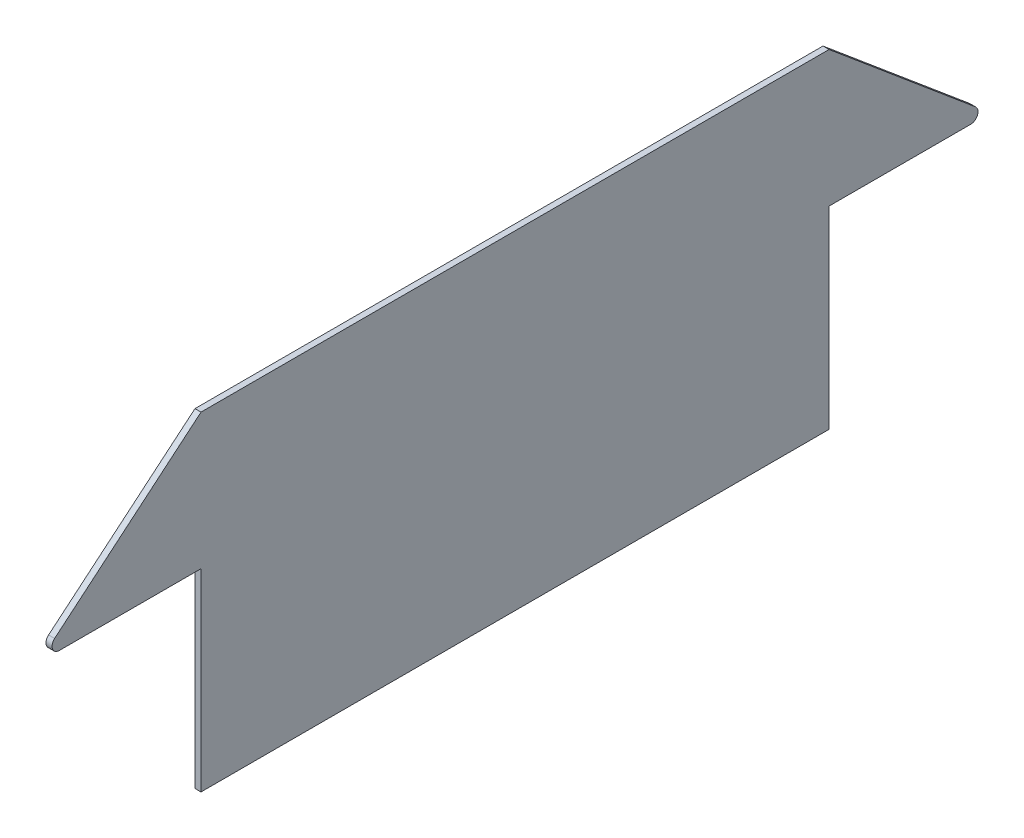
ISO-10303-21;
HEADER;
FILE_DESCRIPTION(('STEP AP214'),'2;1');
FILE_NAME('part.step','',(''),(''),'','','');
FILE_SCHEMA(('AUTOMOTIVE_DESIGN { 1 0 10303 214 1 1 1 1 }'));
ENDSEC;
DATA;
#1=APPLICATION_CONTEXT('core data for automotive mechanical design processes');
#2=APPLICATION_PROTOCOL_DEFINITION('international standard','automotive_design',2000,#1);
#3=PRODUCT_CONTEXT('',#1,'mechanical');
#4=PRODUCT('Part','Part','',(#3));
#5=PRODUCT_RELATED_PRODUCT_CATEGORY('part','',(#4));
#6=PRODUCT_DEFINITION_FORMATION('','',#4);
#7=PRODUCT_DEFINITION_CONTEXT('part definition',#1,'design');
#8=PRODUCT_DEFINITION('design','',#6,#7);
#9=PRODUCT_DEFINITION_SHAPE('','',#8);
#10=(LENGTH_UNIT() NAMED_UNIT(*) SI_UNIT(.MILLI.,.METRE.));
#11=(NAMED_UNIT(*) PLANE_ANGLE_UNIT() SI_UNIT($,.RADIAN.));
#12=(NAMED_UNIT(*) SI_UNIT($,.STERADIAN.) SOLID_ANGLE_UNIT());
#13=UNCERTAINTY_MEASURE_WITH_UNIT(LENGTH_MEASURE(1.E-05),#10,'distance_accuracy_value','');
#14=(GEOMETRIC_REPRESENTATION_CONTEXT(3) GLOBAL_UNCERTAINTY_ASSIGNED_CONTEXT((#13)) GLOBAL_UNIT_ASSIGNED_CONTEXT((#10,
#11,#12)) REPRESENTATION_CONTEXT('',''));
#15=CARTESIAN_POINT('',(0.,0.,0.));
#16=DIRECTION('',(0.,0.,1.));
#17=DIRECTION('',(1.,0.,0.));
#18=AXIS2_PLACEMENT_3D('',#15,#16,#17);
#19=CARTESIAN_POINT('',(6.35,-101.6,-330.));
#20=DIRECTION('',(0.,0.,1.));
#21=DIRECTION('',(1.,0.,0.));
#22=AXIS2_PLACEMENT_3D('',#19,#20,#21);
#23=PLANE('',#22);
#24=DIRECTION('',(0.,1.,0.));
#25=VECTOR('',#24,1.);
#26=CARTESIAN_POINT('',(0.,-101.6,-330.));
#27=LINE('',#26,#25);
#28=CARTESIAN_POINT('',(0.,-101.6,-330.));
#29=VERTEX_POINT('',#28);
#30=CARTESIAN_POINT('',(0.,101.6,-330.));
#31=VERTEX_POINT('',#30);
#32=EDGE_CURVE('E128',#29,#31,#27,.T.);
#33=ORIENTED_EDGE('',*,*,#32,.T.);
#34=DIRECTION('',(-1.,0.,0.));
#35=VECTOR('',#34,1.);
#36=CARTESIAN_POINT('',(6.35,101.6,-330.));
#37=LINE('',#36,#35);
#38=CARTESIAN_POINT('',(6.35,101.6,-330.));
#39=VERTEX_POINT('',#38);
#40=EDGE_CURVE('E112',#39,#31,#37,.T.);
#41=ORIENTED_EDGE('',*,*,#40,.F.);
#42=DIRECTION('',(0.,1.,0.));
#43=VECTOR('',#42,1.);
#44=CARTESIAN_POINT('',(6.35,-101.6,-330.));
#45=LINE('',#44,#43);
#46=CARTESIAN_POINT('',(6.35,-101.6,-330.));
#47=VERTEX_POINT('',#46);
#48=EDGE_CURVE('E115',#47,#39,#45,.T.);
#49=ORIENTED_EDGE('',*,*,#48,.F.);
#50=DIRECTION('',(-1.,0.,0.));
#51=VECTOR('',#50,1.);
#52=CARTESIAN_POINT('',(6.35,-101.6,-330.));
#53=LINE('',#52,#51);
#54=EDGE_CURVE('E175',#47,#29,#53,.T.);
#55=ORIENTED_EDGE('',*,*,#54,.T.);
#56=EDGE_LOOP('',(#33,#41,#49,#55));
#57=FACE_BOUND('',#56,.T.);
#58=ADVANCED_FACE('F34',(#57),#23,.F.);
#59=CARTESIAN_POINT('',(6.35,101.6,-482.4));
#60=DIRECTION('',(0.,1.,0.));
#61=DIRECTION('',(0.,0.,1.));
#62=AXIS2_PLACEMENT_3D('',#59,#60,#61);
#63=PLANE('',#62);
#64=DIRECTION('',(0.,0.,-1.));
#65=VECTOR('',#64,1.);
#66=CARTESIAN_POINT('',(0.,101.6,-482.4));
#67=LINE('',#66,#65);
#68=CARTESIAN_POINT('',(0.,101.6,-478.910703677293));
#69=VERTEX_POINT('',#68);
#70=EDGE_CURVE('E161',#31,#69,#67,.T.);
#71=ORIENTED_EDGE('',*,*,#70,.T.);
#72=DIRECTION('',(-1.,0.,0.));
#73=VECTOR('',#72,1.);
#74=CARTESIAN_POINT('',(6.35,101.6,-478.910703677293));
#75=LINE('',#74,#73);
#76=CARTESIAN_POINT('',(6.35,101.6,-478.910703677293));
#77=VERTEX_POINT('',#76);
#78=EDGE_CURVE('E11',#69,#77,#75,.F.);
#79=ORIENTED_EDGE('',*,*,#78,.T.);
#80=DIRECTION('',(0.,0.,-1.));
#81=VECTOR('',#80,1.);
#82=CARTESIAN_POINT('',(6.35,101.6,-330.));
#83=LINE('',#82,#81);
#84=EDGE_CURVE('E108',#39,#77,#83,.T.);
#85=ORIENTED_EDGE('',*,*,#84,.F.);
#86=ORIENTED_EDGE('',*,*,#40,.T.);
#87=EDGE_LOOP('',(#71,#79,#85,#86));
#88=FACE_BOUND('',#87,.T.);
#89=ADVANCED_FACE('F110',(#88),#63,.F.);
#90=CARTESIAN_POINT('',(6.35,112.814382213805,-486.48170132151));
#91=DIRECTION('',(0.,-0.766044443118977,0.64278760968654));
#92=DIRECTION('',(0.,-0.64278760968654,-0.766044443118977));
#93=AXIS2_PLACEMENT_3D('',#90,#91,#92);
#94=PLANE('',#93);
#95=DIRECTION('',(0.,0.642787609686541,0.766044443118977));
#96=VECTOR('',#95,1.);
#97=CARTESIAN_POINT('',(6.35,101.6,-499.846481613537));
#98=LINE('',#97,#96);
#99=CARTESIAN_POINT('',(6.35,115.057258656567,-483.808745263104));
#100=VERTEX_POINT('',#99);
#101=CARTESIAN_POINT('',(6.35,244.118120078678,-330.));
#102=VERTEX_POINT('',#101);
#103=EDGE_CURVE('E114',#100,#102,#98,.T.);
#104=ORIENTED_EDGE('',*,*,#103,.F.);
#105=DIRECTION('',(-1.,0.,0.));
#106=VECTOR('',#105,1.);
#107=CARTESIAN_POINT('',(6.35,115.057258656567,-483.808745263104));
#108=LINE('',#107,#106);
#109=CARTESIAN_POINT('',(0.,115.057258656567,-483.808745263104));
#110=VERTEX_POINT('',#109);
#111=EDGE_CURVE('E42',#100,#110,#108,.T.);
#112=ORIENTED_EDGE('',*,*,#111,.T.);
#113=DIRECTION('',(0.,0.64278760968654,0.766044443118977));
#114=VECTOR('',#113,1.);
#115=CARTESIAN_POINT('',(0.,112.814382213805,-486.48170132151));
#116=LINE('',#115,#114);
#117=CARTESIAN_POINT('',(0.,244.118120078678,-330.));
#118=VERTEX_POINT('',#117);
#119=EDGE_CURVE('E153',#110,#118,#116,.T.);
#120=ORIENTED_EDGE('',*,*,#119,.T.);
#121=DIRECTION('',(-1.,0.,0.));
#122=VECTOR('',#121,1.);
#123=CARTESIAN_POINT('',(6.35,244.118120078678,-330.));
#124=LINE('',#123,#122);
#125=EDGE_CURVE('E130',#102,#118,#124,.T.);
#126=ORIENTED_EDGE('',*,*,#125,.F.);
#127=EDGE_LOOP('',(#104,#112,#120,#126));
#128=FACE_BOUND('',#127,.T.);
#129=ADVANCED_FACE('F151',(#128),#94,.F.);
#130=CARTESIAN_POINT('',(6.35,244.118120078678,-330.));
#131=DIRECTION('',(0.,-1.,0.));
#132=DIRECTION('',(0.,0.,-1.));
#133=AXIS2_PLACEMENT_3D('',#130,#131,#132);
#134=PLANE('',#133);
#135=DIRECTION('',(0.,0.,1.));
#136=VECTOR('',#135,1.);
#137=CARTESIAN_POINT('',(0.,244.118120078678,-330.));
#138=LINE('',#137,#136);
#139=CARTESIAN_POINT('',(0.,244.118120078678,330.));
#140=VERTEX_POINT('',#139);
#141=EDGE_CURVE('E160',#118,#140,#138,.T.);
#142=ORIENTED_EDGE('',*,*,#141,.T.);
#143=DIRECTION('',(-1.,0.,0.));
#144=VECTOR('',#143,1.);
#145=CARTESIAN_POINT('',(6.35,244.118120078678,330.));
#146=LINE('',#145,#144);
#147=CARTESIAN_POINT('',(6.35,244.118120078678,330.));
#148=VERTEX_POINT('',#147);
#149=EDGE_CURVE('E136',#148,#140,#146,.T.);
#150=ORIENTED_EDGE('',*,*,#149,.F.);
#151=DIRECTION('',(0.,0.,1.));
#152=VECTOR('',#151,1.);
#153=CARTESIAN_POINT('',(6.35,244.118120078678,-330.));
#154=LINE('',#153,#152);
#155=EDGE_CURVE('E205',#102,#148,#154,.T.);
#156=ORIENTED_EDGE('',*,*,#155,.F.);
#157=ORIENTED_EDGE('',*,*,#125,.T.);
#158=EDGE_LOOP('',(#142,#150,#156,#157));
#159=FACE_BOUND('',#158,.T.);
#160=ADVANCED_FACE('F210',(#159),#134,.F.);
#161=CARTESIAN_POINT('',(6.35,244.118120078678,330.));
#162=DIRECTION('',(0.,-0.766044443118977,-0.64278760968654));
#163=DIRECTION('',(0.,0.64278760968654,-0.766044443118977));
#164=AXIS2_PLACEMENT_3D('',#161,#162,#163);
#165=PLANE('',#164);
#166=DIRECTION('',(0.,-0.64278760968654,0.766044443118977));
#167=VECTOR('',#166,1.);
#168=CARTESIAN_POINT('',(0.,244.118120078678,330.));
#169=LINE('',#168,#167);
#170=CARTESIAN_POINT('',(0.,115.057258656567,483.808745263104));
#171=VERTEX_POINT('',#170);
#172=EDGE_CURVE('E163',#140,#171,#169,.T.);
#173=ORIENTED_EDGE('',*,*,#172,.T.);
#174=DIRECTION('',(-1.,0.,0.));
#175=VECTOR('',#174,1.);
#176=CARTESIAN_POINT('',(6.35,115.057258656567,483.808745263104));
#177=LINE('',#176,#175);
#178=CARTESIAN_POINT('',(6.35,115.057258656567,483.808745263104));
#179=VERTEX_POINT('',#178);
#180=EDGE_CURVE('E143',#171,#179,#177,.F.);
#181=ORIENTED_EDGE('',*,*,#180,.T.);
#182=DIRECTION('',(0.,-0.64278760968654,0.766044443118977));
#183=VECTOR('',#182,1.);
#184=CARTESIAN_POINT('',(6.35,244.118120078678,330.));
#185=LINE('',#184,#183);
#186=EDGE_CURVE('E188',#148,#179,#185,.T.);
#187=ORIENTED_EDGE('',*,*,#186,.F.);
#188=ORIENTED_EDGE('',*,*,#149,.T.);
#189=EDGE_LOOP('',(#173,#181,#187,#188));
#190=FACE_BOUND('',#189,.T.);
#191=ADVANCED_FACE('F186',(#190),#165,.F.);
#192=CARTESIAN_POINT('',(6.35,101.6,330.));
#193=DIRECTION('',(0.,1.,0.));
#194=DIRECTION('',(0.,0.,1.));
#195=AXIS2_PLACEMENT_3D('',#192,#193,#194);
#196=PLANE('',#195);
#197=DIRECTION('',(0.,0.,-1.));
#198=VECTOR('',#197,1.);
#199=CARTESIAN_POINT('',(6.35,101.6,499.846481613537));
#200=LINE('',#199,#198);
#201=CARTESIAN_POINT('',(6.35,101.6,478.910703677293));
#202=VERTEX_POINT('',#201);
#203=CARTESIAN_POINT('',(6.35,101.6,330.));
#204=VERTEX_POINT('',#203);
#205=EDGE_CURVE('E200',#202,#204,#200,.T.);
#206=ORIENTED_EDGE('',*,*,#205,.F.);
#207=DIRECTION('',(-1.,0.,0.));
#208=VECTOR('',#207,1.);
#209=CARTESIAN_POINT('',(6.35,101.6,478.910703677293));
#210=LINE('',#209,#208);
#211=CARTESIAN_POINT('',(0.,101.6,478.910703677293));
#212=VERTEX_POINT('',#211);
#213=EDGE_CURVE('E129',#202,#212,#210,.T.);
#214=ORIENTED_EDGE('',*,*,#213,.T.);
#215=DIRECTION('',(0.,0.,-1.));
#216=VECTOR('',#215,1.);
#217=CARTESIAN_POINT('',(0.,101.6,330.));
#218=LINE('',#217,#216);
#219=CARTESIAN_POINT('',(0.,101.6,330.));
#220=VERTEX_POINT('',#219);
#221=EDGE_CURVE('E170',#212,#220,#218,.T.);
#222=ORIENTED_EDGE('',*,*,#221,.T.);
#223=DIRECTION('',(-1.,0.,0.));
#224=VECTOR('',#223,1.);
#225=CARTESIAN_POINT('',(6.35,101.6,330.));
#226=LINE('',#225,#224);
#227=EDGE_CURVE('E180',#204,#220,#226,.T.);
#228=ORIENTED_EDGE('',*,*,#227,.F.);
#229=EDGE_LOOP('',(#206,#214,#222,#228));
#230=FACE_BOUND('',#229,.T.);
#231=ADVANCED_FACE('F198',(#230),#196,.F.);
#232=CARTESIAN_POINT('',(6.35,-101.6,330.));
#233=DIRECTION('',(0.,0.,-1.));
#234=DIRECTION('',(-1.,0.,0.));
#235=AXIS2_PLACEMENT_3D('',#232,#233,#234);
#236=PLANE('',#235);
#237=DIRECTION('',(0.,-1.,0.));
#238=VECTOR('',#237,1.);
#239=CARTESIAN_POINT('',(0.,-101.6,330.));
#240=LINE('',#239,#238);
#241=CARTESIAN_POINT('',(0.,-101.6,330.));
#242=VERTEX_POINT('',#241);
#243=EDGE_CURVE('E172',#220,#242,#240,.T.);
#244=ORIENTED_EDGE('',*,*,#243,.T.);
#245=DIRECTION('',(-1.,0.,0.));
#246=VECTOR('',#245,1.);
#247=CARTESIAN_POINT('',(6.35,-101.6,330.));
#248=LINE('',#247,#246);
#249=CARTESIAN_POINT('',(6.35,-101.6,330.));
#250=VERTEX_POINT('',#249);
#251=EDGE_CURVE('E177',#250,#242,#248,.T.);
#252=ORIENTED_EDGE('',*,*,#251,.F.);
#253=DIRECTION('',(0.,-1.,0.));
#254=VECTOR('',#253,1.);
#255=CARTESIAN_POINT('',(6.35,-101.6,330.));
#256=LINE('',#255,#254);
#257=EDGE_CURVE('E202',#204,#250,#256,.T.);
#258=ORIENTED_EDGE('',*,*,#257,.F.);
#259=ORIENTED_EDGE('',*,*,#227,.T.);
#260=EDGE_LOOP('',(#244,#252,#258,#259));
#261=FACE_BOUND('',#260,.T.);
#262=ADVANCED_FACE('F239',(#261),#236,.F.);
#263=CARTESIAN_POINT('',(6.35,-101.6,330.));
#264=DIRECTION('',(0.,1.,0.));
#265=DIRECTION('',(0.,0.,1.));
#266=AXIS2_PLACEMENT_3D('',#263,#264,#265);
#267=PLANE('',#266);
#268=DIRECTION('',(0.,0.,-1.));
#269=VECTOR('',#268,1.);
#270=CARTESIAN_POINT('',(0.,-101.6,330.));
#271=LINE('',#270,#269);
#272=EDGE_CURVE('E125',#242,#29,#271,.T.);
#273=ORIENTED_EDGE('',*,*,#272,.T.);
#274=ORIENTED_EDGE('',*,*,#54,.F.);
#275=DIRECTION('',(0.,0.,-1.));
#276=VECTOR('',#275,1.);
#277=CARTESIAN_POINT('',(6.35,-101.6,330.));
#278=LINE('',#277,#276);
#279=EDGE_CURVE('E121',#250,#47,#278,.T.);
#280=ORIENTED_EDGE('',*,*,#279,.F.);
#281=ORIENTED_EDGE('',*,*,#251,.T.);
#282=EDGE_LOOP('',(#273,#274,#280,#281));
#283=FACE_BOUND('',#282,.T.);
#284=ADVANCED_FACE('F234',(#283),#267,.F.);
#285=CARTESIAN_POINT('',(6.35,0.,0.));
#286=DIRECTION('',(-1.,0.,0.));
#287=DIRECTION('',(0.,0.,1.));
#288=AXIS2_PLACEMENT_3D('',#285,#286,#287);
#289=PLANE('',#288);
#290=ORIENTED_EDGE('',*,*,#186,.T.);
#291=CARTESIAN_POINT('',(6.35,109.22,478.910703677293));
#292=DIRECTION('',(-1.,0.,0.));
#293=DIRECTION('',(0.,0.,1.));
#294=AXIS2_PLACEMENT_3D('',#291,#292,#293);
#295=CIRCLE('',#294,7.62);
#296=EDGE_CURVE('E146',#179,#202,#295,.F.);
#297=ORIENTED_EDGE('',*,*,#296,.T.);
#298=ORIENTED_EDGE('',*,*,#205,.T.);
#299=ORIENTED_EDGE('',*,*,#257,.T.);
#300=ORIENTED_EDGE('',*,*,#279,.T.);
#301=ORIENTED_EDGE('',*,*,#48,.T.);
#302=ORIENTED_EDGE('',*,*,#84,.T.);
#303=CARTESIAN_POINT('',(6.35,109.22,-478.910703677293));
#304=DIRECTION('',(-1.,0.,0.));
#305=DIRECTION('',(0.,0.,1.));
#306=AXIS2_PLACEMENT_3D('',#303,#304,#305);
#307=CIRCLE('',#306,7.62);
#308=EDGE_CURVE('E49',#77,#100,#307,.F.);
#309=ORIENTED_EDGE('',*,*,#308,.T.);
#310=ORIENTED_EDGE('',*,*,#103,.T.);
#311=ORIENTED_EDGE('',*,*,#155,.T.);
#312=EDGE_LOOP('',(#290,#297,#298,#299,#300,#301,#302,#309,#310,#311));
#313=FACE_BOUND('',#312,.T.);
#314=ADVANCED_FACE('F119',(#313),#289,.F.);
#315=CARTESIAN_POINT('',(0.,0.,0.));
#316=DIRECTION('',(-1.,0.,0.));
#317=DIRECTION('',(0.,0.,1.));
#318=AXIS2_PLACEMENT_3D('',#315,#316,#317);
#319=PLANE('',#318);
#320=ORIENTED_EDGE('',*,*,#221,.F.);
#321=CARTESIAN_POINT('',(0.,109.22,478.910703677293));
#322=DIRECTION('',(-1.,0.,0.));
#323=DIRECTION('',(0.,0.,1.));
#324=AXIS2_PLACEMENT_3D('',#321,#322,#323);
#325=CIRCLE('',#324,7.62);
#326=EDGE_CURVE('E141',#212,#171,#325,.T.);
#327=ORIENTED_EDGE('',*,*,#326,.T.);
#328=ORIENTED_EDGE('',*,*,#172,.F.);
#329=ORIENTED_EDGE('',*,*,#141,.F.);
#330=ORIENTED_EDGE('',*,*,#119,.F.);
#331=CARTESIAN_POINT('',(0.,109.22,-478.910703677293));
#332=DIRECTION('',(-1.,0.,0.));
#333=DIRECTION('',(0.,0.,1.));
#334=AXIS2_PLACEMENT_3D('',#331,#332,#333);
#335=CIRCLE('',#334,7.62);
#336=EDGE_CURVE('E133',#110,#69,#335,.T.);
#337=ORIENTED_EDGE('',*,*,#336,.T.);
#338=ORIENTED_EDGE('',*,*,#70,.F.);
#339=ORIENTED_EDGE('',*,*,#32,.F.);
#340=ORIENTED_EDGE('',*,*,#272,.F.);
#341=ORIENTED_EDGE('',*,*,#243,.F.);
#342=EDGE_LOOP('',(#320,#327,#328,#329,#330,#337,#338,#339,#340,#341));
#343=FACE_BOUND('',#342,.T.);
#344=ADVANCED_FACE('F158',(#343),#319,.T.);
#345=CARTESIAN_POINT('',(6.35,109.22,478.910703677293));
#346=DIRECTION('',(-1.,0.,0.));
#347=DIRECTION('',(0.,0.,1.));
#348=AXIS2_PLACEMENT_3D('',#345,#346,#347);
#349=CYLINDRICAL_SURFACE('',#348,7.62);
#350=ORIENTED_EDGE('',*,*,#296,.F.);
#351=ORIENTED_EDGE('',*,*,#180,.F.);
#352=ORIENTED_EDGE('',*,*,#326,.F.);
#353=ORIENTED_EDGE('',*,*,#213,.F.);
#354=EDGE_LOOP('',(#350,#351,#352,#353));
#355=FACE_BOUND('',#354,.T.);
#356=ADVANCED_FACE('F195',(#355),#349,.T.);
#357=CARTESIAN_POINT('',(6.35,109.22,-478.910703677293));
#358=DIRECTION('',(-1.,0.,0.));
#359=DIRECTION('',(0.,0.,1.));
#360=AXIS2_PLACEMENT_3D('',#357,#358,#359);
#361=CYLINDRICAL_SURFACE('',#360,7.62);
#362=ORIENTED_EDGE('',*,*,#308,.F.);
#363=ORIENTED_EDGE('',*,*,#78,.F.);
#364=ORIENTED_EDGE('',*,*,#336,.F.);
#365=ORIENTED_EDGE('',*,*,#111,.F.);
#366=EDGE_LOOP('',(#362,#363,#364,#365));
#367=FACE_BOUND('',#366,.T.);
#368=ADVANCED_FACE('F36',(#367),#361,.T.);
#369=CLOSED_SHELL('',(#58,#89,#129,#160,#191,#231,#262,#284,#314,#344,#356,#368));
#370=MANIFOLD_SOLID_BREP('B2',#369);
#371=ADVANCED_BREP_SHAPE_REPRESENTATION('',(#18,#370),#14);
#372=SHAPE_DEFINITION_REPRESENTATION(#9,#371);
ENDSEC;
END-ISO-10303-21;
